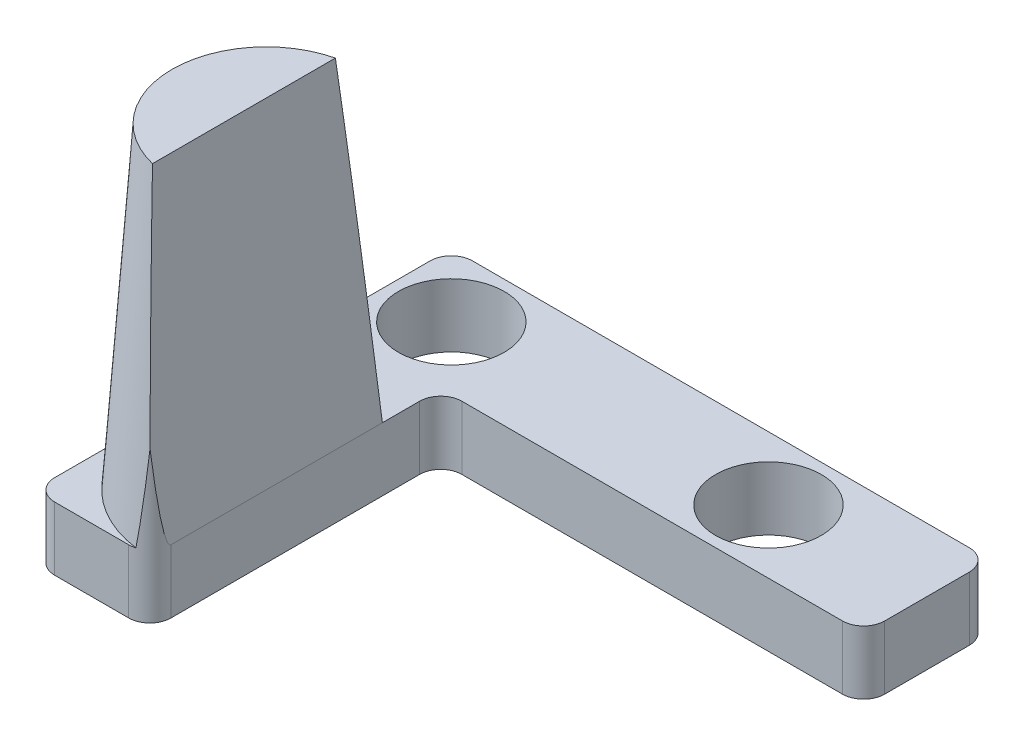
ISO-10303-21;
HEADER;
FILE_DESCRIPTION(('STEP AP214'),'2;1');
FILE_NAME('part.step','',(''),(''),'','','');
FILE_SCHEMA(('AUTOMOTIVE_DESIGN { 1 0 10303 214 1 1 1 1 }'));
ENDSEC;
DATA;
#1=APPLICATION_CONTEXT('core data for automotive mechanical design processes');
#2=APPLICATION_PROTOCOL_DEFINITION('international standard','automotive_design',2000,#1);
#3=PRODUCT_CONTEXT('',#1,'mechanical');
#4=PRODUCT('Part','Part','',(#3));
#5=PRODUCT_RELATED_PRODUCT_CATEGORY('part','',(#4));
#6=PRODUCT_DEFINITION_FORMATION('','',#4);
#7=PRODUCT_DEFINITION_CONTEXT('part definition',#1,'design');
#8=PRODUCT_DEFINITION('design','',#6,#7);
#9=PRODUCT_DEFINITION_SHAPE('','',#8);
#10=(LENGTH_UNIT() NAMED_UNIT(*) SI_UNIT(.MILLI.,.METRE.));
#11=(NAMED_UNIT(*) PLANE_ANGLE_UNIT() SI_UNIT($,.RADIAN.));
#12=(NAMED_UNIT(*) SI_UNIT($,.STERADIAN.) SOLID_ANGLE_UNIT());
#13=UNCERTAINTY_MEASURE_WITH_UNIT(LENGTH_MEASURE(1.E-05),#10,'distance_accuracy_value','');
#14=(GEOMETRIC_REPRESENTATION_CONTEXT(3) GLOBAL_UNCERTAINTY_ASSIGNED_CONTEXT((#13)) GLOBAL_UNIT_ASSIGNED_CONTEXT((#10,
#11,#12)) REPRESENTATION_CONTEXT('',''));
#15=CARTESIAN_POINT('',(0.,0.,0.));
#16=DIRECTION('',(0.,0.,1.));
#17=DIRECTION('',(1.,0.,0.));
#18=AXIS2_PLACEMENT_3D('',#15,#16,#17);
#19=CARTESIAN_POINT('',(0.,3.,0.));
#20=DIRECTION('',(0.,-1.,0.));
#21=DIRECTION('',(0.,0.,-1.));
#22=AXIS2_PLACEMENT_3D('',#19,#20,#21);
#23=PLANE('',#22);
#24=DIRECTION('',(-1.,0.,0.));
#25=VECTOR('',#24,1.);
#26=CARTESIAN_POINT('',(0.,3.,6.));
#27=LINE('',#26,#25);
#28=CARTESIAN_POINT('',(-0.999999999999999,3.,6.));
#29=VERTEX_POINT('',#28);
#30=CARTESIAN_POINT('',(-19.,3.,6.));
#31=VERTEX_POINT('',#30);
#32=EDGE_CURVE('E361',#29,#31,#27,.T.);
#33=ORIENTED_EDGE('',*,*,#32,.F.);
#34=CARTESIAN_POINT('',(-0.999999999999999,3.,5.));
#35=DIRECTION('',(0.,-1.,0.));
#36=DIRECTION('',(0.,0.,-1.));
#37=AXIS2_PLACEMENT_3D('',#34,#35,#36);
#38=CIRCLE('',#37,1.);
#39=CARTESIAN_POINT('',(0.,3.,5.));
#40=VERTEX_POINT('',#39);
#41=EDGE_CURVE('E13',#29,#40,#38,.F.);
#42=ORIENTED_EDGE('',*,*,#41,.T.);
#43=DIRECTION('',(0.,0.,1.));
#44=VECTOR('',#43,1.);
#45=CARTESIAN_POINT('',(0.,3.,0.));
#46=LINE('',#45,#44);
#47=CARTESIAN_POINT('',(0.,3.,1.));
#48=VERTEX_POINT('',#47);
#49=EDGE_CURVE('E367',#48,#40,#46,.T.);
#50=ORIENTED_EDGE('',*,*,#49,.F.);
#51=CARTESIAN_POINT('',(-1.,3.,1.));
#52=DIRECTION('',(0.,-1.,0.));
#53=DIRECTION('',(0.,0.,-1.));
#54=AXIS2_PLACEMENT_3D('',#51,#52,#53);
#55=CIRCLE('',#54,1.);
#56=CARTESIAN_POINT('',(-1.,3.,0.));
#57=VERTEX_POINT('',#56);
#58=EDGE_CURVE('E423',#48,#57,#55,.F.);
#59=ORIENTED_EDGE('',*,*,#58,.T.);
#60=DIRECTION('',(-1.,0.,0.));
#61=VECTOR('',#60,1.);
#62=CARTESIAN_POINT('',(0.,3.,0.));
#63=LINE('',#62,#61);
#64=CARTESIAN_POINT('',(-24.5,3.,0.));
#65=VERTEX_POINT('',#64);
#66=EDGE_CURVE('E372',#57,#65,#63,.T.);
#67=ORIENTED_EDGE('',*,*,#66,.T.);
#68=CARTESIAN_POINT('',(-24.5,3.,1.));
#69=DIRECTION('',(0.,-1.,0.));
#70=DIRECTION('',(0.,0.,-1.));
#71=AXIS2_PLACEMENT_3D('',#68,#69,#70);
#72=CIRCLE('',#71,1.);
#73=CARTESIAN_POINT('',(-25.5,3.,1.));
#74=VERTEX_POINT('',#73);
#75=EDGE_CURVE('E420',#65,#74,#72,.F.);
#76=ORIENTED_EDGE('',*,*,#75,.T.);
#77=DIRECTION('',(0.,0.,1.));
#78=VECTOR('',#77,1.);
#79=CARTESIAN_POINT('',(-25.5,3.,0.));
#80=LINE('',#79,#78);
#81=CARTESIAN_POINT('',(-25.5,3.,14.26));
#82=VERTEX_POINT('',#81);
#83=EDGE_CURVE('E414',#74,#82,#80,.T.);
#84=ORIENTED_EDGE('',*,*,#83,.T.);
#85=CARTESIAN_POINT('',(-20.,3.,14.26));
#86=DIRECTION('',(0.,1.,0.));
#87=DIRECTION('',(0.,0.,1.));
#88=AXIS2_PLACEMENT_3D('',#85,#86,#87);
#89=CIRCLE('',#88,5.5);
#90=CARTESIAN_POINT('',(-20.,3.,8.75999999999999));
#91=VERTEX_POINT('',#90);
#92=EDGE_CURVE('E333',#91,#82,#89,.T.);
#93=ORIENTED_EDGE('',*,*,#92,.F.);
#94=DIRECTION('',(0.,0.,1.));
#95=VECTOR('',#94,1.);
#96=CARTESIAN_POINT('',(-20.,3.,6.));
#97=LINE('',#96,#95);
#98=CARTESIAN_POINT('',(-20.,3.,7.));
#99=VERTEX_POINT('',#98);
#100=EDGE_CURVE('E330',#99,#91,#97,.T.);
#101=ORIENTED_EDGE('',*,*,#100,.F.);
#102=CARTESIAN_POINT('',(-19.,3.,7.));
#103=DIRECTION('',(0.,-1.,0.));
#104=DIRECTION('',(0.,0.,-1.));
#105=AXIS2_PLACEMENT_3D('',#102,#103,#104);
#106=CIRCLE('',#105,1.);
#107=EDGE_CURVE('E338',#99,#31,#106,.T.);
#108=ORIENTED_EDGE('',*,*,#107,.T.);
#109=EDGE_LOOP('',(#33,#42,#50,#59,#67,#76,#84,#93,#101,#108));
#110=FACE_BOUND('',#109,.T.);
#111=CARTESIAN_POINT('',(-22.5,3.,3.));
#112=DIRECTION('',(0.,1.,0.));
#113=DIRECTION('',(0.,0.,1.));
#114=AXIS2_PLACEMENT_3D('',#111,#112,#113);
#115=CIRCLE('',#114,2.5);
#116=CARTESIAN_POINT('',(-22.5,3.,5.5));
#117=VERTEX_POINT('',#116);
#118=EDGE_CURVE('E380',#117,#117,#115,.T.);
#119=ORIENTED_EDGE('',*,*,#118,.F.);
#120=EDGE_LOOP('',(#119));
#121=FACE_BOUND('',#120,.T.);
#122=CARTESIAN_POINT('',(-7.5,3.,3.));
#123=DIRECTION('',(0.,1.,0.));
#124=DIRECTION('',(0.,0.,1.));
#125=AXIS2_PLACEMENT_3D('',#122,#123,#124);
#126=CIRCLE('',#125,2.5);
#127=CARTESIAN_POINT('',(-7.5,3.,5.5));
#128=VERTEX_POINT('',#127);
#129=EDGE_CURVE('E223',#128,#128,#126,.T.);
#130=ORIENTED_EDGE('',*,*,#129,.F.);
#131=EDGE_LOOP('',(#130));
#132=FACE_BOUND('',#131,.T.);
#133=ADVANCED_FACE('F89',(#110,#121,#132),#23,.F.);
#134=CARTESIAN_POINT('',(-25.5,3.,18.76));
#135=VERTEX_POINT('',#134);
#136=EDGE_CURVE('E408',#82,#135,#80,.T.);
#137=ORIENTED_EDGE('',*,*,#136,.T.);
#138=CARTESIAN_POINT('',(-24.5,3.,18.76));
#139=DIRECTION('',(0.,-1.,0.));
#140=DIRECTION('',(0.,0.,-1.));
#141=AXIS2_PLACEMENT_3D('',#138,#139,#140);
#142=CIRCLE('',#141,1.);
#143=CARTESIAN_POINT('',(-24.5,3.,19.76));
#144=VERTEX_POINT('',#143);
#145=EDGE_CURVE('E464',#135,#144,#142,.F.);
#146=ORIENTED_EDGE('',*,*,#145,.T.);
#147=DIRECTION('',(-1.,0.,0.));
#148=VECTOR('',#147,1.);
#149=CARTESIAN_POINT('',(-20.,3.,19.76));
#150=LINE('',#149,#148);
#151=CARTESIAN_POINT('',(-21.,3.,19.76));
#152=VERTEX_POINT('',#151);
#153=EDGE_CURVE('E357',#152,#144,#150,.T.);
#154=ORIENTED_EDGE('',*,*,#153,.F.);
#155=CARTESIAN_POINT('',(-21.,3.,18.76));
#156=DIRECTION('',(0.,-1.,0.));
#157=DIRECTION('',(0.,0.,-1.));
#158=AXIS2_PLACEMENT_3D('',#155,#156,#157);
#159=CIRCLE('',#158,1.);
#160=CARTESIAN_POINT('',(-20.7030213970047,3.,19.714884133999));
#161=VERTEX_POINT('',#160);
#162=EDGE_CURVE('E257',#152,#161,#159,.F.);
#163=ORIENTED_EDGE('',*,*,#162,.T.);
#164=EDGE_CURVE('E355',#82,#161,#89,.T.);
#165=ORIENTED_EDGE('',*,*,#164,.F.);
#166=EDGE_LOOP('',(#137,#146,#154,#163,#165));
#167=FACE_BOUND('',#166,.T.);
#168=ADVANCED_FACE('F285',(#167),#23,.F.);
#169=CARTESIAN_POINT('',(0.,0.,0.));
#170=DIRECTION('',(0.,-1.,0.));
#171=DIRECTION('',(0.,0.,-1.));
#172=AXIS2_PLACEMENT_3D('',#169,#170,#171);
#173=PLANE('',#172);
#174=CARTESIAN_POINT('',(-22.5,0.,3.));
#175=DIRECTION('',(0.,1.,0.));
#176=DIRECTION('',(0.,0.,1.));
#177=AXIS2_PLACEMENT_3D('',#174,#175,#176);
#178=CIRCLE('',#177,2.5);
#179=CARTESIAN_POINT('',(-22.5,0.,5.5));
#180=VERTEX_POINT('',#179);
#181=EDGE_CURVE('E411',#180,#180,#178,.T.);
#182=ORIENTED_EDGE('',*,*,#181,.T.);
#183=EDGE_LOOP('',(#182));
#184=FACE_BOUND('',#183,.T.);
#185=DIRECTION('',(0.,0.,1.));
#186=VECTOR('',#185,1.);
#187=CARTESIAN_POINT('',(0.,0.,0.));
#188=LINE('',#187,#186);
#189=CARTESIAN_POINT('',(0.,0.,1.));
#190=VERTEX_POINT('',#189);
#191=CARTESIAN_POINT('',(0.,0.,5.));
#192=VERTEX_POINT('',#191);
#193=EDGE_CURVE('E390',#190,#192,#188,.T.);
#194=ORIENTED_EDGE('',*,*,#193,.T.);
#195=CARTESIAN_POINT('',(-0.999999999999999,0.,5.));
#196=DIRECTION('',(0.,-1.,0.));
#197=DIRECTION('',(0.,0.,-1.));
#198=AXIS2_PLACEMENT_3D('',#195,#196,#197);
#199=CIRCLE('',#198,1.);
#200=CARTESIAN_POINT('',(-0.999999999999999,0.,6.));
#201=VERTEX_POINT('',#200);
#202=EDGE_CURVE('E112',#192,#201,#199,.T.);
#203=ORIENTED_EDGE('',*,*,#202,.T.);
#204=DIRECTION('',(-1.,0.,0.));
#205=VECTOR('',#204,1.);
#206=CARTESIAN_POINT('',(0.,0.,6.));
#207=LINE('',#206,#205);
#208=CARTESIAN_POINT('',(-19.,0.,6.));
#209=VERTEX_POINT('',#208);
#210=EDGE_CURVE('E393',#201,#209,#207,.T.);
#211=ORIENTED_EDGE('',*,*,#210,.T.);
#212=CARTESIAN_POINT('',(-19.,0.,7.));
#213=DIRECTION('',(0.,-1.,0.));
#214=DIRECTION('',(0.,0.,-1.));
#215=AXIS2_PLACEMENT_3D('',#212,#213,#214);
#216=CIRCLE('',#215,1.);
#217=CARTESIAN_POINT('',(-20.,0.,7.));
#218=VERTEX_POINT('',#217);
#219=EDGE_CURVE('E345',#209,#218,#216,.F.);
#220=ORIENTED_EDGE('',*,*,#219,.T.);
#221=DIRECTION('',(0.,0.,1.));
#222=VECTOR('',#221,1.);
#223=CARTESIAN_POINT('',(-20.,0.,6.));
#224=LINE('',#223,#222);
#225=CARTESIAN_POINT('',(-20.,0.,18.76));
#226=VERTEX_POINT('',#225);
#227=EDGE_CURVE('E376',#218,#226,#224,.T.);
#228=ORIENTED_EDGE('',*,*,#227,.T.);
#229=CARTESIAN_POINT('',(-21.,0.,18.76));
#230=DIRECTION('',(0.,-1.,0.));
#231=DIRECTION('',(0.,0.,-1.));
#232=AXIS2_PLACEMENT_3D('',#229,#230,#231);
#233=CIRCLE('',#232,1.);
#234=CARTESIAN_POINT('',(-21.,0.,19.76));
#235=VERTEX_POINT('',#234);
#236=EDGE_CURVE('E336',#226,#235,#233,.T.);
#237=ORIENTED_EDGE('',*,*,#236,.T.);
#238=DIRECTION('',(-1.,0.,0.));
#239=VECTOR('',#238,1.);
#240=CARTESIAN_POINT('',(-20.,0.,19.76));
#241=LINE('',#240,#239);
#242=CARTESIAN_POINT('',(-24.5,0.,19.76));
#243=VERTEX_POINT('',#242);
#244=EDGE_CURVE('E379',#235,#243,#241,.T.);
#245=ORIENTED_EDGE('',*,*,#244,.T.);
#246=CARTESIAN_POINT('',(-24.5,0.,18.76));
#247=DIRECTION('',(0.,-1.,0.));
#248=DIRECTION('',(0.,0.,-1.));
#249=AXIS2_PLACEMENT_3D('',#246,#247,#248);
#250=CIRCLE('',#249,1.);
#251=CARTESIAN_POINT('',(-25.5,0.,18.76));
#252=VERTEX_POINT('',#251);
#253=EDGE_CURVE('E472',#243,#252,#250,.T.);
#254=ORIENTED_EDGE('',*,*,#253,.T.);
#255=DIRECTION('',(0.,0.,1.));
#256=VECTOR('',#255,1.);
#257=CARTESIAN_POINT('',(-25.5,0.,0.));
#258=LINE('',#257,#256);
#259=CARTESIAN_POINT('',(-25.5,0.,1.));
#260=VERTEX_POINT('',#259);
#261=EDGE_CURVE('E384',#260,#252,#258,.T.);
#262=ORIENTED_EDGE('',*,*,#261,.F.);
#263=CARTESIAN_POINT('',(-24.5,0.,1.));
#264=DIRECTION('',(0.,-1.,0.));
#265=DIRECTION('',(0.,0.,-1.));
#266=AXIS2_PLACEMENT_3D('',#263,#264,#265);
#267=CIRCLE('',#266,1.);
#268=CARTESIAN_POINT('',(-24.5,0.,0.));
#269=VERTEX_POINT('',#268);
#270=EDGE_CURVE('E431',#260,#269,#267,.T.);
#271=ORIENTED_EDGE('',*,*,#270,.T.);
#272=DIRECTION('',(-1.,0.,0.));
#273=VECTOR('',#272,1.);
#274=CARTESIAN_POINT('',(0.,0.,0.));
#275=LINE('',#274,#273);
#276=CARTESIAN_POINT('',(-1.,0.,0.));
#277=VERTEX_POINT('',#276);
#278=EDGE_CURVE('E387',#277,#269,#275,.T.);
#279=ORIENTED_EDGE('',*,*,#278,.F.);
#280=CARTESIAN_POINT('',(-1.,0.,1.));
#281=DIRECTION('',(0.,-1.,0.));
#282=DIRECTION('',(0.,0.,-1.));
#283=AXIS2_PLACEMENT_3D('',#280,#281,#282);
#284=CIRCLE('',#283,1.);
#285=EDGE_CURVE('E440',#277,#190,#284,.T.);
#286=ORIENTED_EDGE('',*,*,#285,.T.);
#287=EDGE_LOOP('',(#194,#203,#211,#220,#228,#237,#245,#254,#262,#271,#279,#286));
#288=FACE_BOUND('',#287,.T.);
#289=CARTESIAN_POINT('',(-7.5,0.,3.));
#290=DIRECTION('',(0.,1.,0.));
#291=DIRECTION('',(0.,0.,1.));
#292=AXIS2_PLACEMENT_3D('',#289,#290,#291);
#293=CIRCLE('',#292,2.5);
#294=CARTESIAN_POINT('',(-7.5,0.,5.5));
#295=VERTEX_POINT('',#294);
#296=EDGE_CURVE('E218',#295,#295,#293,.T.);
#297=ORIENTED_EDGE('',*,*,#296,.T.);
#298=EDGE_LOOP('',(#297));
#299=FACE_BOUND('',#298,.T.);
#300=ADVANCED_FACE('F292',(#184,#288,#299),#173,.T.);
#301=CARTESIAN_POINT('',(-20.,3.,6.));
#302=DIRECTION('',(1.,0.,0.));
#303=DIRECTION('',(0.,0.,-1.));
#304=AXIS2_PLACEMENT_3D('',#301,#302,#303);
#305=PLANE('',#304);
#306=DIRECTION('',(0.,0.,-1.));
#307=VECTOR('',#306,1.);
#308=CARTESIAN_POINT('',(-20.,3.,8.75999999999999));
#309=LINE('',#308,#307);
#310=CARTESIAN_POINT('',(-20.,3.,18.76));
#311=VERTEX_POINT('',#310);
#312=EDGE_CURVE('E211',#311,#91,#309,.T.);
#313=ORIENTED_EDGE('',*,*,#312,.F.);
#314=DIRECTION('',(0.,-1.,0.));
#315=VECTOR('',#314,1.);
#316=CARTESIAN_POINT('',(-20.,3.,18.76));
#317=LINE('',#316,#315);
#318=EDGE_CURVE('E327',#311,#226,#317,.T.);
#319=ORIENTED_EDGE('',*,*,#318,.T.);
#320=ORIENTED_EDGE('',*,*,#227,.F.);
#321=DIRECTION('',(0.,-1.,0.));
#322=VECTOR('',#321,1.);
#323=CARTESIAN_POINT('',(-20.,3.,7.));
#324=LINE('',#323,#322);
#325=EDGE_CURVE('E365',#218,#99,#324,.F.);
#326=ORIENTED_EDGE('',*,*,#325,.T.);
#327=ORIENTED_EDGE('',*,*,#100,.T.);
#328=EDGE_LOOP('',(#313,#319,#320,#326,#327));
#329=FACE_BOUND('',#328,.T.);
#330=ADVANCED_FACE('F298',(#329),#305,.T.);
#331=CARTESIAN_POINT('',(0.,3.,6.));
#332=DIRECTION('',(0.,0.,1.));
#333=DIRECTION('',(1.,0.,0.));
#334=AXIS2_PLACEMENT_3D('',#331,#332,#333);
#335=PLANE('',#334);
#336=ORIENTED_EDGE('',*,*,#210,.F.);
#337=DIRECTION('',(0.,-1.,0.));
#338=VECTOR('',#337,1.);
#339=CARTESIAN_POINT('',(-0.999999999999999,3.,6.));
#340=LINE('',#339,#338);
#341=EDGE_CURVE('E98',#201,#29,#340,.F.);
#342=ORIENTED_EDGE('',*,*,#341,.T.);
#343=ORIENTED_EDGE('',*,*,#32,.T.);
#344=DIRECTION('',(0.,-1.,0.));
#345=VECTOR('',#344,1.);
#346=CARTESIAN_POINT('',(-19.,0.,6.));
#347=LINE('',#346,#345);
#348=EDGE_CURVE('E360',#31,#209,#347,.T.);
#349=ORIENTED_EDGE('',*,*,#348,.T.);
#350=EDGE_LOOP('',(#336,#342,#343,#349));
#351=FACE_BOUND('',#350,.T.);
#352=ADVANCED_FACE('F300',(#351),#335,.T.);
#353=CARTESIAN_POINT('',(0.,3.,0.));
#354=DIRECTION('',(1.,0.,0.));
#355=DIRECTION('',(0.,0.,-1.));
#356=AXIS2_PLACEMENT_3D('',#353,#354,#355);
#357=PLANE('',#356);
#358=ORIENTED_EDGE('',*,*,#49,.T.);
#359=DIRECTION('',(0.,-1.,0.));
#360=VECTOR('',#359,1.);
#361=CARTESIAN_POINT('',(0.,3.,5.));
#362=LINE('',#361,#360);
#363=EDGE_CURVE('E451',#40,#192,#362,.T.);
#364=ORIENTED_EDGE('',*,*,#363,.T.);
#365=ORIENTED_EDGE('',*,*,#193,.F.);
#366=DIRECTION('',(0.,-1.,0.));
#367=VECTOR('',#366,1.);
#368=CARTESIAN_POINT('',(0.,3.,1.));
#369=LINE('',#368,#367);
#370=EDGE_CURVE('E446',#190,#48,#369,.F.);
#371=ORIENTED_EDGE('',*,*,#370,.T.);
#372=EDGE_LOOP('',(#358,#364,#365,#371));
#373=FACE_BOUND('',#372,.T.);
#374=ADVANCED_FACE('F303',(#373),#357,.T.);
#375=CARTESIAN_POINT('',(0.,3.,0.));
#376=DIRECTION('',(0.,0.,1.));
#377=DIRECTION('',(1.,0.,0.));
#378=AXIS2_PLACEMENT_3D('',#375,#376,#377);
#379=PLANE('',#378);
#380=ORIENTED_EDGE('',*,*,#66,.F.);
#381=DIRECTION('',(0.,-1.,0.));
#382=VECTOR('',#381,1.);
#383=CARTESIAN_POINT('',(-1.,0.,0.));
#384=LINE('',#383,#382);
#385=EDGE_CURVE('E437',#57,#277,#384,.T.);
#386=ORIENTED_EDGE('',*,*,#385,.T.);
#387=ORIENTED_EDGE('',*,*,#278,.T.);
#388=DIRECTION('',(0.,-1.,0.));
#389=VECTOR('',#388,1.);
#390=CARTESIAN_POINT('',(-24.5,3.,0.));
#391=LINE('',#390,#389);
#392=EDGE_CURVE('E427',#269,#65,#391,.F.);
#393=ORIENTED_EDGE('',*,*,#392,.T.);
#394=EDGE_LOOP('',(#380,#386,#387,#393));
#395=FACE_BOUND('',#394,.T.);
#396=ADVANCED_FACE('F306',(#395),#379,.F.);
#397=CARTESIAN_POINT('',(-25.5,3.,0.));
#398=DIRECTION('',(1.,0.,0.));
#399=DIRECTION('',(0.,0.,-1.));
#400=AXIS2_PLACEMENT_3D('',#397,#398,#399);
#401=PLANE('',#400);
#402=ORIENTED_EDGE('',*,*,#83,.F.);
#403=DIRECTION('',(0.,-1.,0.));
#404=VECTOR('',#403,1.);
#405=CARTESIAN_POINT('',(-25.5,3.,1.));
#406=LINE('',#405,#404);
#407=EDGE_CURVE('E435',#74,#260,#406,.T.);
#408=ORIENTED_EDGE('',*,*,#407,.T.);
#409=ORIENTED_EDGE('',*,*,#261,.T.);
#410=DIRECTION('',(0.,-1.,0.));
#411=VECTOR('',#410,1.);
#412=CARTESIAN_POINT('',(-25.5,3.,18.76));
#413=LINE('',#412,#411);
#414=EDGE_CURVE('E469',#252,#135,#413,.F.);
#415=ORIENTED_EDGE('',*,*,#414,.T.);
#416=ORIENTED_EDGE('',*,*,#136,.F.);
#417=EDGE_LOOP('',(#402,#408,#409,#415,#416));
#418=FACE_BOUND('',#417,.T.);
#419=ADVANCED_FACE('F309',(#418),#401,.F.);
#420=CARTESIAN_POINT('',(-20.,3.,19.76));
#421=DIRECTION('',(0.,0.,1.));
#422=DIRECTION('',(1.,0.,0.));
#423=AXIS2_PLACEMENT_3D('',#420,#421,#422);
#424=PLANE('',#423);
#425=ORIENTED_EDGE('',*,*,#153,.T.);
#426=DIRECTION('',(0.,-1.,0.));
#427=VECTOR('',#426,1.);
#428=CARTESIAN_POINT('',(-24.5,0.,19.76));
#429=LINE('',#428,#427);
#430=EDGE_CURVE('E474',#144,#243,#429,.T.);
#431=ORIENTED_EDGE('',*,*,#430,.T.);
#432=ORIENTED_EDGE('',*,*,#244,.F.);
#433=DIRECTION('',(0.,-1.,0.));
#434=VECTOR('',#433,1.);
#435=CARTESIAN_POINT('',(-21.,3.,19.76));
#436=LINE('',#435,#434);
#437=EDGE_CURVE('E342',#235,#152,#436,.F.);
#438=ORIENTED_EDGE('',*,*,#437,.T.);
#439=EDGE_LOOP('',(#425,#431,#432,#438));
#440=FACE_BOUND('',#439,.T.);
#441=ADVANCED_FACE('F313',(#440),#424,.T.);
#442=CARTESIAN_POINT('',(-22.5,3.,3.));
#443=DIRECTION('',(0.,-1.,0.));
#444=DIRECTION('',(0.,0.,-1.));
#445=AXIS2_PLACEMENT_3D('',#442,#443,#444);
#446=CYLINDRICAL_SURFACE('',#445,2.5);
#447=ORIENTED_EDGE('',*,*,#118,.T.);
#448=EDGE_LOOP('',(#447));
#449=FACE_BOUND('',#448,.T.);
#450=ORIENTED_EDGE('',*,*,#181,.F.);
#451=EDGE_LOOP('',(#450));
#452=FACE_BOUND('',#451,.T.);
#453=ADVANCED_FACE('F296',(#449,#452),#446,.F.);
#454=CARTESIAN_POINT('',(-7.5,3.,3.));
#455=DIRECTION('',(0.,-1.,0.));
#456=DIRECTION('',(0.,0.,-1.));
#457=AXIS2_PLACEMENT_3D('',#454,#455,#456);
#458=CYLINDRICAL_SURFACE('',#457,2.5);
#459=ORIENTED_EDGE('',*,*,#129,.T.);
#460=EDGE_LOOP('',(#459));
#461=FACE_BOUND('',#460,.T.);
#462=ORIENTED_EDGE('',*,*,#296,.F.);
#463=EDGE_LOOP('',(#462));
#464=FACE_BOUND('',#463,.T.);
#465=ADVANCED_FACE('F243',(#461,#464),#458,.F.);
#466=CARTESIAN_POINT('',(-20.,3.,14.26));
#467=DIRECTION('',(0.,-1.,0.));
#468=DIRECTION('',(0.,0.,1.));
#469=AXIS2_PLACEMENT_3D('',#466,#467,#468);
#470=CONICAL_SURFACE('',#469,5.5,0.0698131700797732);
#471=ORIENTED_EDGE('',*,*,#164,.T.);
#472=CARTESIAN_POINT('',(-20.7030213970047,3.,19.714884133999));
#473=CARTESIAN_POINT('',(-20.6898418314311,3.08228648740074,19.7107802158093));
#474=CARTESIAN_POINT('',(-20.677212475963,3.16465268361294,19.7065582630014));
#475=CARTESIAN_POINT('',(-20.6528957510185,3.32951072187103,19.6979164696422));
#476=CARTESIAN_POINT('',(-20.6412083453036,3.41200255895877,19.6934966367137));
#477=CARTESIAN_POINT('',(-20.6073230013008,3.65960324511319,19.6799983031549));
#478=CARTESIAN_POINT('',(-20.5862984856412,3.82485936126763,19.6706798463501));
#479=CARTESIAN_POINT('',(-20.546623124144,4.15555001942859,19.6515895750279));
#480=CARTESIAN_POINT('',(-20.527971213717,4.32098444758247,19.6418179665447));
#481=CARTESIAN_POINT('',(-20.4925630711038,4.65204044395033,19.6219271159274));
#482=CARTESIAN_POINT('',(-20.475806915689,4.81766201946897,19.6118078597364));
#483=CARTESIAN_POINT('',(-20.4253552769537,5.3408210306425,19.579434462583));
#484=CARTESIAN_POINT('',(-20.3945021913662,5.69860316166207,19.5566918636502));
#485=CARTESIAN_POINT('',(-20.3521572334864,6.2356251081739,19.5219882744612));
#486=CARTESIAN_POINT('',(-20.3386951603886,6.41473525068778,19.5103191464849));
#487=CARTESIAN_POINT('',(-20.3129480831283,6.77302871217512,19.4868179691697));
#488=CARTESIAN_POINT('',(-20.3006630732463,6.95221203078878,19.4749859206227));
#489=CARTESIAN_POINT('',(-20.2888974569492,7.1314261142434,19.4630883111436));
#490=B_SPLINE_CURVE_WITH_KNOTS('',3,(#472,#473,#474,#475,#476,#477,#478,#479,#480,#481,#482,
#483,#484,#485,#486,#487,#488,#489),.UNSPECIFIED.,.F.,.F.,(4,2,2,2,2,2,2,2,4),(0.,
0.250303070268715,0.500596506342471,1.00111622731724,1.50141056660676,2.00172515876726,
3.08114629038871,3.62112619558874,4.16110347685832),.UNSPECIFIED.);
#491=CARTESIAN_POINT('',(-20.2888974569492,7.1314261142434,19.4630883111436));
#492=VERTEX_POINT('',#491);
#493=EDGE_CURVE('E216',#161,#492,#490,.T.);
#494=ORIENTED_EDGE('',*,*,#493,.T.);
#495=CARTESIAN_POINT('',(-21.0489021791527,18.,18.5857457194478));
#496=CARTESIAN_POINT('',(-21.0007149259437,17.3108901740303,18.6470057192233));
#497=CARTESIAN_POINT('',(-20.9525198754072,16.6216688410828,18.7069908975393));
#498=CARTESIAN_POINT('',(-20.8561162576279,15.2430328772822,18.8246684986813));
#499=CARTESIAN_POINT('',(-20.8079076904165,14.5536182468776,18.8823609267837));
#500=CARTESIAN_POINT('',(-20.6632667569274,12.48515652999,19.0523821730096));
#501=CARTESIAN_POINT('',(-20.566816900881,11.1058593281635,19.1616577991948));
#502=CARTESIAN_POINT('',(-20.3919793241305,8.60556549392184,19.3536851966641));
#503=CARTESIAN_POINT('',(-20.3135975949237,7.4846545439107,19.4375670109846));
#504=CARTESIAN_POINT('',(-20.1568131922866,5.24253312753963,19.6015091218252));
#505=CARTESIAN_POINT('',(-20.0784105184912,4.12132265595854,19.6815693466728));
#506=CARTESIAN_POINT('',(-20.,3.,19.76));
#507=B_SPLINE_CURVE_WITH_KNOTS('',3,(#495,#496,#497,#498,#499,#500,#501,#502,#503,#504,#505,
#506),.UNSPECIFIED.,.F.,.F.,(4,2,2,2,2,4),(0.,2.08050741289039,4.16101003765596,
8.32191780865612,11.7022358380686,15.0826172391986),.UNSPECIFIED.);
#508=CARTESIAN_POINT('',(-21.0489021791527,18.,18.5857457194478));
#509=VERTEX_POINT('',#508);
#510=EDGE_CURVE('E199',#509,#492,#507,.T.);
#511=ORIENTED_EDGE('',*,*,#510,.F.);
#512=CARTESIAN_POINT('',(-20.,18.,14.26));
#513=DIRECTION('',(0.,1.,0.));
#514=DIRECTION('',(0.,0.,1.));
#515=AXIS2_PLACEMENT_3D('',#512,#513,#514);
#516=CIRCLE('',#515,4.45109782084734);
#517=CARTESIAN_POINT('',(-21.0489021791527,18.,9.93425428055222));
#518=VERTEX_POINT('',#517);
#519=EDGE_CURVE('E206',#518,#509,#516,.T.);
#520=ORIENTED_EDGE('',*,*,#519,.F.);
#521=CARTESIAN_POINT('',(-21.0489021791527,18.,9.93425428055222));
#522=CARTESIAN_POINT('',(-21.0007149259437,17.3108901740303,9.87299428077664));
#523=CARTESIAN_POINT('',(-20.9525198754072,16.6216688410828,9.8130091024607));
#524=CARTESIAN_POINT('',(-20.8561162576279,15.2430328772822,9.69533150131866));
#525=CARTESIAN_POINT('',(-20.8079076904165,14.5536182468776,9.63763907321627));
#526=CARTESIAN_POINT('',(-20.6632667569274,12.48515652999,9.46761782699037));
#527=CARTESIAN_POINT('',(-20.566816900881,11.1058593281635,9.35834220080522));
#528=CARTESIAN_POINT('',(-20.3919793241305,8.60556549392184,9.16631480333588));
#529=CARTESIAN_POINT('',(-20.3135975949237,7.4846545439107,9.08243298901541));
#530=CARTESIAN_POINT('',(-20.1568131922866,5.24253312753963,8.91849087817482));
#531=CARTESIAN_POINT('',(-20.0784105184912,4.12132265595854,8.83843065332719));
#532=CARTESIAN_POINT('',(-20.,3.,8.75999999999999));
#533=B_SPLINE_CURVE_WITH_KNOTS('',3,(#521,#522,#523,#524,#525,#526,#527,#528,#529,#530,#531,
#532),.UNSPECIFIED.,.F.,.F.,(4,2,2,2,2,4),(0.,2.08050741289039,4.16101003765596,
8.32191780865612,11.7022358380686,15.0826172391986),.UNSPECIFIED.);
#534=EDGE_CURVE('E202',#518,#91,#533,.T.);
#535=ORIENTED_EDGE('',*,*,#534,.T.);
#536=ORIENTED_EDGE('',*,*,#92,.T.);
#537=EDGE_LOOP('',(#471,#494,#511,#520,#535,#536));
#538=FACE_BOUND('',#537,.T.);
#539=ADVANCED_FACE('F214',(#538),#470,.T.);
#540=CARTESIAN_POINT('',(-20.,3.,8.75999999999999));
#541=DIRECTION('',(0.997564050259824,0.0697564737441253,0.));
#542=DIRECTION('',(-0.0697564737441253,0.997564050259824,0.));
#543=AXIS2_PLACEMENT_3D('',#540,#541,#542);
#544=PLANE('',#543);
#545=ORIENTED_EDGE('',*,*,#510,.T.);
#546=CARTESIAN_POINT('',(-21.,17.3006662567118,18.76));
#547=DIRECTION('',(0.997564050259824,0.0697564737441253,0.));
#548=DIRECTION('',(0.0697564737441253,-0.997564050259824,0.));
#549=AXIS2_PLACEMENT_3D('',#546,#547,#548);
#550=ELLIPSE('',#549,14.3355870262037,1.);
#551=EDGE_CURVE('E256',#492,#311,#550,.T.);
#552=ORIENTED_EDGE('',*,*,#551,.T.);
#553=ORIENTED_EDGE('',*,*,#312,.T.);
#554=ORIENTED_EDGE('',*,*,#534,.F.);
#555=DIRECTION('',(0.,0.,1.));
#556=VECTOR('',#555,1.);
#557=CARTESIAN_POINT('',(-21.0489021791527,18.,8.75999999999999));
#558=LINE('',#557,#556);
#559=EDGE_CURVE('E195',#509,#518,#558,.F.);
#560=ORIENTED_EDGE('',*,*,#559,.F.);
#561=EDGE_LOOP('',(#545,#552,#553,#554,#560));
#562=FACE_BOUND('',#561,.T.);
#563=ADVANCED_FACE('F197',(#562),#544,.T.);
#564=CARTESIAN_POINT('',(-20.,18.,14.26));
#565=DIRECTION('',(0.,1.,0.));
#566=DIRECTION('',(0.,0.,1.));
#567=AXIS2_PLACEMENT_3D('',#564,#565,#566);
#568=PLANE('',#567);
#569=ORIENTED_EDGE('',*,*,#519,.T.);
#570=ORIENTED_EDGE('',*,*,#559,.T.);
#571=EDGE_LOOP('',(#569,#570));
#572=FACE_BOUND('',#571,.T.);
#573=ADVANCED_FACE('F208',(#572),#568,.T.);
#574=CARTESIAN_POINT('',(-19.,3.,7.));
#575=DIRECTION('',(0.,1.,0.));
#576=DIRECTION('',(0.,0.,1.));
#577=AXIS2_PLACEMENT_3D('',#574,#575,#576);
#578=CYLINDRICAL_SURFACE('',#577,1.);
#579=ORIENTED_EDGE('',*,*,#107,.F.);
#580=ORIENTED_EDGE('',*,*,#325,.F.);
#581=ORIENTED_EDGE('',*,*,#219,.F.);
#582=ORIENTED_EDGE('',*,*,#348,.F.);
#583=EDGE_LOOP('',(#579,#580,#581,#582));
#584=FACE_BOUND('',#583,.T.);
#585=ADVANCED_FACE('F266',(#584),#578,.F.);
#586=CARTESIAN_POINT('',(-21.,3.,18.76));
#587=DIRECTION('',(0.,-1.,0.));
#588=DIRECTION('',(0.,0.,-1.));
#589=AXIS2_PLACEMENT_3D('',#586,#587,#588);
#590=CYLINDRICAL_SURFACE('',#589,1.);
#591=ORIENTED_EDGE('',*,*,#162,.F.);
#592=ORIENTED_EDGE('',*,*,#437,.F.);
#593=ORIENTED_EDGE('',*,*,#236,.F.);
#594=ORIENTED_EDGE('',*,*,#318,.F.);
#595=ORIENTED_EDGE('',*,*,#551,.F.);
#596=ORIENTED_EDGE('',*,*,#493,.F.);
#597=EDGE_LOOP('',(#591,#592,#593,#594,#595,#596));
#598=FACE_BOUND('',#597,.T.);
#599=ADVANCED_FACE('F260',(#598),#590,.T.);
#600=CARTESIAN_POINT('',(-24.5,3.,18.76));
#601=DIRECTION('',(0.,1.,0.));
#602=DIRECTION('',(0.,0.,1.));
#603=AXIS2_PLACEMENT_3D('',#600,#601,#602);
#604=CYLINDRICAL_SURFACE('',#603,1.);
#605=ORIENTED_EDGE('',*,*,#145,.F.);
#606=ORIENTED_EDGE('',*,*,#414,.F.);
#607=ORIENTED_EDGE('',*,*,#253,.F.);
#608=ORIENTED_EDGE('',*,*,#430,.F.);
#609=EDGE_LOOP('',(#605,#606,#607,#608));
#610=FACE_BOUND('',#609,.T.);
#611=ADVANCED_FACE('F265',(#610),#604,.T.);
#612=CARTESIAN_POINT('',(-24.5,3.,1.));
#613=DIRECTION('',(0.,-1.,0.));
#614=DIRECTION('',(0.,0.,-1.));
#615=AXIS2_PLACEMENT_3D('',#612,#613,#614);
#616=CYLINDRICAL_SURFACE('',#615,1.);
#617=ORIENTED_EDGE('',*,*,#75,.F.);
#618=ORIENTED_EDGE('',*,*,#392,.F.);
#619=ORIENTED_EDGE('',*,*,#270,.F.);
#620=ORIENTED_EDGE('',*,*,#407,.F.);
#621=EDGE_LOOP('',(#617,#618,#619,#620));
#622=FACE_BOUND('',#621,.T.);
#623=ADVANCED_FACE('F271',(#622),#616,.T.);
#624=CARTESIAN_POINT('',(-1.,3.,1.));
#625=DIRECTION('',(0.,1.,0.));
#626=DIRECTION('',(0.,0.,1.));
#627=AXIS2_PLACEMENT_3D('',#624,#625,#626);
#628=CYLINDRICAL_SURFACE('',#627,1.);
#629=ORIENTED_EDGE('',*,*,#58,.F.);
#630=ORIENTED_EDGE('',*,*,#370,.F.);
#631=ORIENTED_EDGE('',*,*,#285,.F.);
#632=ORIENTED_EDGE('',*,*,#385,.F.);
#633=EDGE_LOOP('',(#629,#630,#631,#632));
#634=FACE_BOUND('',#633,.T.);
#635=ADVANCED_FACE('F274',(#634),#628,.T.);
#636=CARTESIAN_POINT('',(-0.999999999999999,3.,5.));
#637=DIRECTION('',(0.,-1.,0.));
#638=DIRECTION('',(0.,0.,-1.));
#639=AXIS2_PLACEMENT_3D('',#636,#637,#638);
#640=CYLINDRICAL_SURFACE('',#639,1.);
#641=ORIENTED_EDGE('',*,*,#41,.F.);
#642=ORIENTED_EDGE('',*,*,#341,.F.);
#643=ORIENTED_EDGE('',*,*,#202,.F.);
#644=ORIENTED_EDGE('',*,*,#363,.F.);
#645=EDGE_LOOP('',(#641,#642,#643,#644));
#646=FACE_BOUND('',#645,.T.);
#647=ADVANCED_FACE('F91',(#646),#640,.T.);
#648=CLOSED_SHELL('',(#133,#168,#300,#330,#352,#374,#396,#419,#441,#453,#465,#539,#563,#573,
#585,#599,#611,#623,#635,#647));
#649=MANIFOLD_SOLID_BREP('B2',#648);
#650=ADVANCED_BREP_SHAPE_REPRESENTATION('',(#18,#649),#14);
#651=SHAPE_DEFINITION_REPRESENTATION(#9,#650);
ENDSEC;
END-ISO-10303-21;
